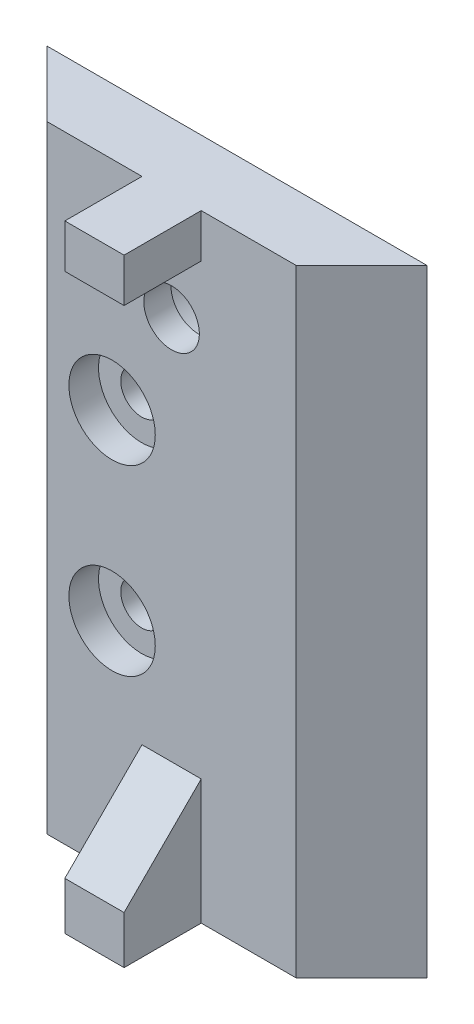
ISO-10303-21;
HEADER;
FILE_DESCRIPTION(('STEP AP214'),'2;1');
FILE_NAME('part.step','',(''),(''),'','','');
FILE_SCHEMA(('AUTOMOTIVE_DESIGN { 1 0 10303 214 1 1 1 1 }'));
ENDSEC;
DATA;
#1=APPLICATION_CONTEXT('core data for automotive mechanical design processes');
#2=APPLICATION_PROTOCOL_DEFINITION('international standard','automotive_design',2000,#1);
#3=PRODUCT_CONTEXT('',#1,'mechanical');
#4=PRODUCT('Part','Part','',(#3));
#5=PRODUCT_RELATED_PRODUCT_CATEGORY('part','',(#4));
#6=PRODUCT_DEFINITION_FORMATION('','',#4);
#7=PRODUCT_DEFINITION_CONTEXT('part definition',#1,'design');
#8=PRODUCT_DEFINITION('design','',#6,#7);
#9=PRODUCT_DEFINITION_SHAPE('','',#8);
#10=(LENGTH_UNIT() NAMED_UNIT(*) SI_UNIT(.MILLI.,.METRE.));
#11=(NAMED_UNIT(*) PLANE_ANGLE_UNIT() SI_UNIT($,.RADIAN.));
#12=(NAMED_UNIT(*) SI_UNIT($,.STERADIAN.) SOLID_ANGLE_UNIT());
#13=UNCERTAINTY_MEASURE_WITH_UNIT(LENGTH_MEASURE(1.E-05),#10,'distance_accuracy_value','');
#14=(GEOMETRIC_REPRESENTATION_CONTEXT(3) GLOBAL_UNCERTAINTY_ASSIGNED_CONTEXT((#13)) GLOBAL_UNIT_ASSIGNED_CONTEXT((#10,
#11,#12)) REPRESENTATION_CONTEXT('',''));
#15=CARTESIAN_POINT('',(0.,0.,0.));
#16=DIRECTION('',(0.,0.,1.));
#17=DIRECTION('',(1.,0.,0.));
#18=AXIS2_PLACEMENT_3D('',#15,#16,#17);
#19=CARTESIAN_POINT('',(10.1,25.,-10.1));
#20=DIRECTION('',(0.,0.,-1.));
#21=DIRECTION('',(-1.,0.,0.));
#22=AXIS2_PLACEMENT_3D('',#19,#20,#21);
#23=PLANE('',#22);
#24=CARTESIAN_POINT('',(0.,16.2790697674419,-10.1));
#25=DIRECTION('',(0.,0.,-1.));
#26=DIRECTION('',(-1.,0.,0.));
#27=AXIS2_PLACEMENT_3D('',#24,#25,#26);
#28=CIRCLE('',#27,2.25);
#29=CARTESIAN_POINT('',(-2.25,16.2790697674419,-10.1));
#30=VERTEX_POINT('',#29);
#31=EDGE_CURVE('E140',#30,#30,#28,.T.);
#32=ORIENTED_EDGE('',*,*,#31,.T.);
#33=EDGE_LOOP('',(#32));
#34=FACE_BOUND('',#33,.T.);
#35=DIRECTION('',(1.,0.,0.));
#36=VECTOR('',#35,1.);
#37=CARTESIAN_POINT('',(-2.6,21.4617325152062,-10.1));
#38=LINE('',#37,#36);
#39=CARTESIAN_POINT('',(-2.4,21.4617325152062,-10.1));
#40=VERTEX_POINT('',#39);
#41=CARTESIAN_POINT('',(2.4,21.4617325152062,-10.1));
#42=VERTEX_POINT('',#41);
#43=EDGE_CURVE('E119',#40,#42,#38,.T.);
#44=ORIENTED_EDGE('',*,*,#43,.F.);
#45=DIRECTION('',(0.,-1.,0.));
#46=VECTOR('',#45,1.);
#47=CARTESIAN_POINT('',(-2.4,25.,-10.1));
#48=LINE('',#47,#46);
#49=CARTESIAN_POINT('',(-2.4,25.,-10.1));
#50=VERTEX_POINT('',#49);
#51=EDGE_CURVE('E158',#50,#40,#48,.T.);
#52=ORIENTED_EDGE('',*,*,#51,.F.);
#53=DIRECTION('',(1.,0.,0.));
#54=VECTOR('',#53,1.);
#55=CARTESIAN_POINT('',(-10.1,25.,-10.1));
#56=LINE('',#55,#54);
#57=CARTESIAN_POINT('',(-10.1,25.,-10.1));
#58=VERTEX_POINT('',#57);
#59=EDGE_CURVE('E231',#58,#50,#56,.T.);
#60=ORIENTED_EDGE('',*,*,#59,.F.);
#61=DIRECTION('',(0.,-1.,0.));
#62=VECTOR('',#61,1.);
#63=CARTESIAN_POINT('',(-10.1,25.,-10.1));
#64=LINE('',#63,#62);
#65=CARTESIAN_POINT('',(-10.1,-25.,-10.1));
#66=VERTEX_POINT('',#65);
#67=EDGE_CURVE('E160',#58,#66,#64,.T.);
#68=ORIENTED_EDGE('',*,*,#67,.T.);
#69=DIRECTION('',(1.,0.,0.));
#70=VECTOR('',#69,1.);
#71=CARTESIAN_POINT('',(-10.1,-25.,-10.1));
#72=LINE('',#71,#70);
#73=CARTESIAN_POINT('',(-2.4,-25.,-10.1));
#74=VERTEX_POINT('',#73);
#75=EDGE_CURVE('E185',#66,#74,#72,.T.);
#76=ORIENTED_EDGE('',*,*,#75,.T.);
#77=CARTESIAN_POINT('',(-2.4,-14.880987875174,-10.1));
#78=VERTEX_POINT('',#77);
#79=EDGE_CURVE('E157',#78,#74,#48,.T.);
#80=ORIENTED_EDGE('',*,*,#79,.F.);
#81=DIRECTION('',(-1.,0.,0.));
#82=VECTOR('',#81,1.);
#83=CARTESIAN_POINT('',(10.1,-14.880987875174,-10.1));
#84=LINE('',#83,#82);
#85=CARTESIAN_POINT('',(2.4,-14.880987875174,-10.1));
#86=VERTEX_POINT('',#85);
#87=EDGE_CURVE('E11',#78,#86,#84,.F.);
#88=ORIENTED_EDGE('',*,*,#87,.T.);
#89=DIRECTION('',(0.,-1.,0.));
#90=VECTOR('',#89,1.);
#91=CARTESIAN_POINT('',(2.4,25.,-10.1));
#92=LINE('',#91,#90);
#93=CARTESIAN_POINT('',(2.4,-25.,-10.1));
#94=VERTEX_POINT('',#93);
#95=EDGE_CURVE('E146',#86,#94,#92,.T.);
#96=ORIENTED_EDGE('',*,*,#95,.T.);
#97=DIRECTION('',(1.,0.,0.));
#98=VECTOR('',#97,1.);
#99=CARTESIAN_POINT('',(10.1,-25.,-10.1));
#100=LINE('',#99,#98);
#101=CARTESIAN_POINT('',(10.1,-25.,-10.1));
#102=VERTEX_POINT('',#101);
#103=EDGE_CURVE('E201',#94,#102,#100,.T.);
#104=ORIENTED_EDGE('',*,*,#103,.T.);
#105=DIRECTION('',(0.,-1.,0.));
#106=VECTOR('',#105,1.);
#107=CARTESIAN_POINT('',(10.1,25.,-10.1));
#108=LINE('',#107,#106);
#109=CARTESIAN_POINT('',(10.1,25.,-10.1));
#110=VERTEX_POINT('',#109);
#111=EDGE_CURVE('E149',#110,#102,#108,.T.);
#112=ORIENTED_EDGE('',*,*,#111,.F.);
#113=DIRECTION('',(1.,0.,0.));
#114=VECTOR('',#113,1.);
#115=CARTESIAN_POINT('',(10.1,25.,-10.1));
#116=LINE('',#115,#114);
#117=CARTESIAN_POINT('',(2.4,25.,-10.1));
#118=VERTEX_POINT('',#117);
#119=EDGE_CURVE('E144',#118,#110,#116,.T.);
#120=ORIENTED_EDGE('',*,*,#119,.F.);
#121=EDGE_CURVE('E136',#118,#42,#92,.T.);
#122=ORIENTED_EDGE('',*,*,#121,.T.);
#123=EDGE_LOOP('',(#44,#52,#60,#68,#76,#80,#88,#96,#104,#112,#120,#122));
#124=FACE_BOUND('',#123,.T.);
#125=CARTESIAN_POINT('',(-4.82176305006965,-7.4,-10.1));
#126=DIRECTION('',(0.,0.,1.));
#127=DIRECTION('',(1.,0.,0.));
#128=AXIS2_PLACEMENT_3D('',#125,#126,#127);
#129=CIRCLE('',#128,3.5);
#130=CARTESIAN_POINT('',(-1.32176305006965,-7.4,-10.1));
#131=VERTEX_POINT('',#130);
#132=EDGE_CURVE('E269',#131,#131,#129,.T.);
#133=ORIENTED_EDGE('',*,*,#132,.F.);
#134=EDGE_LOOP('',(#133));
#135=FACE_BOUND('',#134,.T.);
#136=CARTESIAN_POINT('',(-4.82176305006965,7.4,-10.1));
#137=DIRECTION('',(0.,0.,1.));
#138=DIRECTION('',(1.,0.,0.));
#139=AXIS2_PLACEMENT_3D('',#136,#137,#138);
#140=CIRCLE('',#139,3.5);
#141=CARTESIAN_POINT('',(-1.32176305006965,7.4,-10.1));
#142=VERTEX_POINT('',#141);
#143=EDGE_CURVE('E281',#142,#142,#140,.T.);
#144=ORIENTED_EDGE('',*,*,#143,.F.);
#145=EDGE_LOOP('',(#144));
#146=FACE_BOUND('',#145,.T.);
#147=ADVANCED_FACE('F35',(#34,#124,#135,#146),#23,.F.);
#148=CARTESIAN_POINT('',(-2.4,25.,-10.1));
#149=DIRECTION('',(1.,0.,0.));
#150=DIRECTION('',(0.,0.,-1.));
#151=AXIS2_PLACEMENT_3D('',#148,#149,#150);
#152=PLANE('',#151);
#153=DIRECTION('',(0.,-1.,0.));
#154=VECTOR('',#153,1.);
#155=CARTESIAN_POINT('',(-2.4,25.,-3.85));
#156=LINE('',#155,#154);
#157=CARTESIAN_POINT('',(-2.4,-21.1309878751741,-3.85));
#158=VERTEX_POINT('',#157);
#159=CARTESIAN_POINT('',(-2.4,-25.,-3.85));
#160=VERTEX_POINT('',#159);
#161=EDGE_CURVE('E153',#158,#160,#156,.T.);
#162=ORIENTED_EDGE('',*,*,#161,.F.);
#163=DIRECTION('',(0.,-0.707106781186551,0.707106781186544));
#164=VECTOR('',#163,1.);
#165=CARTESIAN_POINT('',(-2.4,-21.1309878751741,-3.85));
#166=LINE('',#165,#164);
#167=EDGE_CURVE('E166',#158,#78,#166,.F.);
#168=ORIENTED_EDGE('',*,*,#167,.T.);
#169=ORIENTED_EDGE('',*,*,#79,.T.);
#170=DIRECTION('',(0.,0.,1.));
#171=VECTOR('',#170,1.);
#172=CARTESIAN_POINT('',(-2.4,-25.,-10.1));
#173=LINE('',#172,#171);
#174=EDGE_CURVE('E191',#74,#160,#173,.T.);
#175=ORIENTED_EDGE('',*,*,#174,.T.);
#176=EDGE_LOOP('',(#162,#168,#169,#175));
#177=FACE_BOUND('',#176,.T.);
#178=ADVANCED_FACE('F182',(#177),#152,.F.);
#179=CARTESIAN_POINT('',(-2.4,25.,-3.85));
#180=DIRECTION('',(0.,0.,-1.));
#181=DIRECTION('',(-1.,0.,0.));
#182=AXIS2_PLACEMENT_3D('',#179,#180,#181);
#183=PLANE('',#182);
#184=DIRECTION('',(0.,-1.,0.));
#185=VECTOR('',#184,1.);
#186=CARTESIAN_POINT('',(2.4,25.,-3.85));
#187=LINE('',#186,#185);
#188=CARTESIAN_POINT('',(2.4,-21.1309878751741,-3.85));
#189=VERTEX_POINT('',#188);
#190=CARTESIAN_POINT('',(2.4,-25.,-3.85));
#191=VERTEX_POINT('',#190);
#192=EDGE_CURVE('E145',#189,#191,#187,.T.);
#193=ORIENTED_EDGE('',*,*,#192,.F.);
#194=DIRECTION('',(-1.,0.,0.));
#195=VECTOR('',#194,1.);
#196=CARTESIAN_POINT('',(-2.4,-21.1309878751741,-3.85));
#197=LINE('',#196,#195);
#198=EDGE_CURVE('E163',#189,#158,#197,.T.);
#199=ORIENTED_EDGE('',*,*,#198,.T.);
#200=ORIENTED_EDGE('',*,*,#161,.T.);
#201=DIRECTION('',(1.,0.,0.));
#202=VECTOR('',#201,1.);
#203=CARTESIAN_POINT('',(-2.4,-25.,-3.85));
#204=LINE('',#203,#202);
#205=EDGE_CURVE('E179',#160,#191,#204,.T.);
#206=ORIENTED_EDGE('',*,*,#205,.T.);
#207=EDGE_LOOP('',(#193,#199,#200,#206));
#208=FACE_BOUND('',#207,.T.);
#209=ADVANCED_FACE('F176',(#208),#183,.F.);
#210=CARTESIAN_POINT('',(2.4,25.,-10.1));
#211=DIRECTION('',(-1.,0.,0.));
#212=DIRECTION('',(0.,0.,1.));
#213=AXIS2_PLACEMENT_3D('',#210,#211,#212);
#214=PLANE('',#213);
#215=ORIENTED_EDGE('',*,*,#95,.F.);
#216=DIRECTION('',(0.,0.707106781186551,-0.707106781186544));
#217=VECTOR('',#216,1.);
#218=CARTESIAN_POINT('',(2.4,-21.1309878751741,-3.85));
#219=LINE('',#218,#217);
#220=EDGE_CURVE('E45',#86,#189,#219,.F.);
#221=ORIENTED_EDGE('',*,*,#220,.T.);
#222=ORIENTED_EDGE('',*,*,#192,.T.);
#223=DIRECTION('',(0.,0.,-1.));
#224=VECTOR('',#223,1.);
#225=CARTESIAN_POINT('',(2.4,-25.,-10.1));
#226=LINE('',#225,#224);
#227=EDGE_CURVE('E196',#191,#94,#226,.T.);
#228=ORIENTED_EDGE('',*,*,#227,.T.);
#229=EDGE_LOOP('',(#215,#221,#222,#228));
#230=FACE_BOUND('',#229,.T.);
#231=ADVANCED_FACE('F170',(#230),#214,.F.);
#232=CARTESIAN_POINT('',(-15.4,25.,-15.4));
#233=DIRECTION('',(0.707106781186547,0.,-0.707106781186548));
#234=DIRECTION('',(-0.707106781186548,0.,-0.707106781186547));
#235=AXIS2_PLACEMENT_3D('',#232,#233,#234);
#236=PLANE('',#235);
#237=DIRECTION('',(0.707106781186548,0.,0.707106781186547));
#238=VECTOR('',#237,1.);
#239=CARTESIAN_POINT('',(-15.4,-25.,-15.4));
#240=LINE('',#239,#238);
#241=CARTESIAN_POINT('',(-15.4,-25.,-15.4));
#242=VERTEX_POINT('',#241);
#243=EDGE_CURVE('E192',#242,#66,#240,.T.);
#244=ORIENTED_EDGE('',*,*,#243,.T.);
#245=ORIENTED_EDGE('',*,*,#67,.F.);
#246=DIRECTION('',(0.707106781186548,0.,0.707106781186547));
#247=VECTOR('',#246,1.);
#248=CARTESIAN_POINT('',(-15.4,25.,-15.4));
#249=LINE('',#248,#247);
#250=CARTESIAN_POINT('',(-15.4,25.,-15.4));
#251=VERTEX_POINT('',#250);
#252=EDGE_CURVE('E207',#251,#58,#249,.T.);
#253=ORIENTED_EDGE('',*,*,#252,.F.);
#254=DIRECTION('',(0.,-1.,0.));
#255=VECTOR('',#254,1.);
#256=CARTESIAN_POINT('',(-15.4,25.,-15.4));
#257=LINE('',#256,#255);
#258=EDGE_CURVE('E208',#251,#242,#257,.T.);
#259=ORIENTED_EDGE('',*,*,#258,.T.);
#260=EDGE_LOOP('',(#244,#245,#253,#259));
#261=FACE_BOUND('',#260,.T.);
#262=ADVANCED_FACE('F228',(#261),#236,.F.);
#263=ORIENTED_EDGE('',*,*,#51,.T.);
#264=DIRECTION('',(0.,0.,1.));
#265=VECTOR('',#264,1.);
#266=CARTESIAN_POINT('',(-2.4,21.4617325152062,-10.1));
#267=LINE('',#266,#265);
#268=CARTESIAN_POINT('',(-2.4,21.4617325152062,-3.85));
#269=VERTEX_POINT('',#268);
#270=EDGE_CURVE('E125',#40,#269,#267,.T.);
#271=ORIENTED_EDGE('',*,*,#270,.T.);
#272=CARTESIAN_POINT('',(-2.4,25.,-3.85));
#273=VERTEX_POINT('',#272);
#274=EDGE_CURVE('E154',#273,#269,#156,.T.);
#275=ORIENTED_EDGE('',*,*,#274,.F.);
#276=DIRECTION('',(0.,0.,1.));
#277=VECTOR('',#276,1.);
#278=CARTESIAN_POINT('',(-2.4,25.,-10.1));
#279=LINE('',#278,#277);
#280=EDGE_CURVE('E233',#50,#273,#279,.T.);
#281=ORIENTED_EDGE('',*,*,#280,.F.);
#282=EDGE_LOOP('',(#263,#271,#275,#281));
#283=FACE_BOUND('',#282,.T.);
#284=ADVANCED_FACE('F294',(#283),#152,.F.);
#285=ORIENTED_EDGE('',*,*,#274,.T.);
#286=DIRECTION('',(1.,0.,0.));
#287=VECTOR('',#286,1.);
#288=CARTESIAN_POINT('',(-2.4,21.4617325152062,-3.85));
#289=LINE('',#288,#287);
#290=CARTESIAN_POINT('',(2.4,21.4617325152062,-3.85));
#291=VERTEX_POINT('',#290);
#292=EDGE_CURVE('E129',#269,#291,#289,.T.);
#293=ORIENTED_EDGE('',*,*,#292,.T.);
#294=CARTESIAN_POINT('',(2.4,25.,-3.85));
#295=VERTEX_POINT('',#294);
#296=EDGE_CURVE('E139',#295,#291,#187,.T.);
#297=ORIENTED_EDGE('',*,*,#296,.F.);
#298=DIRECTION('',(1.,0.,0.));
#299=VECTOR('',#298,1.);
#300=CARTESIAN_POINT('',(-2.4,25.,-3.85));
#301=LINE('',#300,#299);
#302=EDGE_CURVE('E239',#273,#295,#301,.T.);
#303=ORIENTED_EDGE('',*,*,#302,.F.);
#304=EDGE_LOOP('',(#285,#293,#297,#303));
#305=FACE_BOUND('',#304,.T.);
#306=ADVANCED_FACE('F300',(#305),#183,.F.);
#307=ORIENTED_EDGE('',*,*,#296,.T.);
#308=DIRECTION('',(0.,0.,1.));
#309=VECTOR('',#308,1.);
#310=CARTESIAN_POINT('',(2.4,21.4617325152062,-3.47319618366129));
#311=LINE('',#310,#309);
#312=EDGE_CURVE('E122',#42,#291,#311,.T.);
#313=ORIENTED_EDGE('',*,*,#312,.F.);
#314=ORIENTED_EDGE('',*,*,#121,.F.);
#315=DIRECTION('',(0.,0.,-1.));
#316=VECTOR('',#315,1.);
#317=CARTESIAN_POINT('',(2.4,25.,-10.1));
#318=LINE('',#317,#316);
#319=EDGE_CURVE('E241',#295,#118,#318,.T.);
#320=ORIENTED_EDGE('',*,*,#319,.F.);
#321=EDGE_LOOP('',(#307,#313,#314,#320));
#322=FACE_BOUND('',#321,.T.);
#323=ADVANCED_FACE('F134',(#322),#214,.F.);
#324=CARTESIAN_POINT('',(15.4,25.,-15.4));
#325=DIRECTION('',(-0.707106781186547,0.,-0.707106781186548));
#326=DIRECTION('',(-0.707106781186548,0.,0.707106781186547));
#327=AXIS2_PLACEMENT_3D('',#324,#325,#326);
#328=PLANE('',#327);
#329=DIRECTION('',(0.707106781186548,0.,-0.707106781186547));
#330=VECTOR('',#329,1.);
#331=CARTESIAN_POINT('',(15.4,-25.,-15.4));
#332=LINE('',#331,#330);
#333=CARTESIAN_POINT('',(15.4,-25.,-15.4));
#334=VERTEX_POINT('',#333);
#335=EDGE_CURVE('E203',#102,#334,#332,.T.);
#336=ORIENTED_EDGE('',*,*,#335,.T.);
#337=DIRECTION('',(0.,-1.,0.));
#338=VECTOR('',#337,1.);
#339=CARTESIAN_POINT('',(15.4,25.,-15.4));
#340=LINE('',#339,#338);
#341=CARTESIAN_POINT('',(15.4,25.,-15.4));
#342=VERTEX_POINT('',#341);
#343=EDGE_CURVE('E210',#342,#334,#340,.T.);
#344=ORIENTED_EDGE('',*,*,#343,.F.);
#345=DIRECTION('',(0.707106781186548,0.,-0.707106781186547));
#346=VECTOR('',#345,1.);
#347=CARTESIAN_POINT('',(15.4,25.,-15.4));
#348=LINE('',#347,#346);
#349=EDGE_CURVE('E222',#110,#342,#348,.T.);
#350=ORIENTED_EDGE('',*,*,#349,.F.);
#351=ORIENTED_EDGE('',*,*,#111,.T.);
#352=EDGE_LOOP('',(#336,#344,#350,#351));
#353=FACE_BOUND('',#352,.T.);
#354=ADVANCED_FACE('F221',(#353),#328,.F.);
#355=CARTESIAN_POINT('',(-15.4,25.,-15.4));
#356=DIRECTION('',(0.,0.,1.));
#357=DIRECTION('',(1.,0.,0.));
#358=AXIS2_PLACEMENT_3D('',#355,#356,#357);
#359=PLANE('',#358);
#360=CARTESIAN_POINT('',(-4.82176305006965,7.4,-15.4));
#361=DIRECTION('',(0.,0.,1.));
#362=DIRECTION('',(1.,0.,0.));
#363=AXIS2_PLACEMENT_3D('',#360,#361,#362);
#364=CIRCLE('',#363,1.7);
#365=CARTESIAN_POINT('',(-3.12176305006965,7.4,-15.4));
#366=VERTEX_POINT('',#365);
#367=EDGE_CURVE('E272',#366,#366,#364,.T.);
#368=ORIENTED_EDGE('',*,*,#367,.T.);
#369=EDGE_LOOP('',(#368));
#370=FACE_BOUND('',#369,.T.);
#371=CARTESIAN_POINT('',(-4.82176305006965,-7.4,-15.4));
#372=DIRECTION('',(0.,0.,1.));
#373=DIRECTION('',(1.,0.,0.));
#374=AXIS2_PLACEMENT_3D('',#371,#372,#373);
#375=CIRCLE('',#374,1.7);
#376=CARTESIAN_POINT('',(-3.12176305006965,-7.4,-15.4));
#377=VERTEX_POINT('',#376);
#378=EDGE_CURVE('E260',#377,#377,#375,.T.);
#379=ORIENTED_EDGE('',*,*,#378,.T.);
#380=EDGE_LOOP('',(#379));
#381=FACE_BOUND('',#380,.T.);
#382=CARTESIAN_POINT('',(0.,16.2790697674419,-15.4));
#383=DIRECTION('',(0.,0.,-1.));
#384=DIRECTION('',(-1.,0.,0.));
#385=AXIS2_PLACEMENT_3D('',#382,#383,#384);
#386=CIRCLE('',#385,4.49999999999999);
#387=CARTESIAN_POINT('',(-4.49999999999999,16.2790697674419,-15.4));
#388=VERTEX_POINT('',#387);
#389=EDGE_CURVE('E257',#388,#388,#386,.T.);
#390=ORIENTED_EDGE('',*,*,#389,.F.);
#391=EDGE_LOOP('',(#390));
#392=FACE_BOUND('',#391,.T.);
#393=DIRECTION('',(-1.,0.,0.));
#394=VECTOR('',#393,1.);
#395=CARTESIAN_POINT('',(-15.4,-25.,-15.4));
#396=LINE('',#395,#394);
#397=EDGE_CURVE('E205',#334,#242,#396,.T.);
#398=ORIENTED_EDGE('',*,*,#397,.T.);
#399=ORIENTED_EDGE('',*,*,#258,.F.);
#400=DIRECTION('',(-1.,0.,0.));
#401=VECTOR('',#400,1.);
#402=CARTESIAN_POINT('',(-15.4,25.,-15.4));
#403=LINE('',#402,#401);
#404=EDGE_CURVE('E211',#342,#251,#403,.T.);
#405=ORIENTED_EDGE('',*,*,#404,.F.);
#406=ORIENTED_EDGE('',*,*,#343,.T.);
#407=EDGE_LOOP('',(#398,#399,#405,#406));
#408=FACE_BOUND('',#407,.T.);
#409=ADVANCED_FACE('F225',(#370,#381,#392,#408),#359,.F.);
#410=CARTESIAN_POINT('',(0.,25.,0.));
#411=DIRECTION('',(0.,-1.,0.));
#412=DIRECTION('',(0.,0.,-1.));
#413=AXIS2_PLACEMENT_3D('',#410,#411,#412);
#414=PLANE('',#413);
#415=ORIENTED_EDGE('',*,*,#252,.T.);
#416=ORIENTED_EDGE('',*,*,#59,.T.);
#417=ORIENTED_EDGE('',*,*,#280,.T.);
#418=ORIENTED_EDGE('',*,*,#302,.T.);
#419=ORIENTED_EDGE('',*,*,#319,.T.);
#420=ORIENTED_EDGE('',*,*,#119,.T.);
#421=ORIENTED_EDGE('',*,*,#349,.T.);
#422=ORIENTED_EDGE('',*,*,#404,.T.);
#423=EDGE_LOOP('',(#415,#416,#417,#418,#419,#420,#421,#422));
#424=FACE_BOUND('',#423,.T.);
#425=ADVANCED_FACE('F386',(#424),#414,.F.);
#426=CARTESIAN_POINT('',(0.,-25.,0.));
#427=DIRECTION('',(0.,-1.,0.));
#428=DIRECTION('',(0.,0.,-1.));
#429=AXIS2_PLACEMENT_3D('',#426,#427,#428);
#430=PLANE('',#429);
#431=ORIENTED_EDGE('',*,*,#243,.F.);
#432=ORIENTED_EDGE('',*,*,#397,.F.);
#433=ORIENTED_EDGE('',*,*,#335,.F.);
#434=ORIENTED_EDGE('',*,*,#103,.F.);
#435=ORIENTED_EDGE('',*,*,#227,.F.);
#436=ORIENTED_EDGE('',*,*,#205,.F.);
#437=ORIENTED_EDGE('',*,*,#174,.F.);
#438=ORIENTED_EDGE('',*,*,#75,.F.);
#439=EDGE_LOOP('',(#431,#432,#433,#434,#435,#436,#437,#438));
#440=FACE_BOUND('',#439,.T.);
#441=ADVANCED_FACE('F194',(#440),#430,.T.);
#442=CARTESIAN_POINT('',(-2.6,21.4617325152062,-3.47319618366129));
#443=DIRECTION('',(0.,1.,0.));
#444=DIRECTION('',(0.,0.,1.));
#445=AXIS2_PLACEMENT_3D('',#442,#443,#444);
#446=PLANE('',#445);
#447=ORIENTED_EDGE('',*,*,#43,.T.);
#448=ORIENTED_EDGE('',*,*,#312,.T.);
#449=ORIENTED_EDGE('',*,*,#292,.F.);
#450=ORIENTED_EDGE('',*,*,#270,.F.);
#451=EDGE_LOOP('',(#447,#448,#449,#450));
#452=FACE_BOUND('',#451,.T.);
#453=ADVANCED_FACE('F121',(#452),#446,.F.);
#454=CARTESIAN_POINT('',(0.,16.2790697674419,-15.4));
#455=DIRECTION('',(0.,0.,-1.));
#456=DIRECTION('',(-1.,0.,0.));
#457=AXIS2_PLACEMENT_3D('',#454,#455,#456);
#458=CYLINDRICAL_SURFACE('',#457,2.25);
#459=ORIENTED_EDGE('',*,*,#31,.F.);
#460=EDGE_LOOP('',(#459));
#461=FACE_BOUND('',#460,.T.);
#462=CARTESIAN_POINT('',(0.,16.2790697674419,-12.3));
#463=DIRECTION('',(0.,0.,-1.));
#464=DIRECTION('',(-1.,0.,0.));
#465=AXIS2_PLACEMENT_3D('',#462,#463,#464);
#466=CIRCLE('',#465,2.25);
#467=CARTESIAN_POINT('',(-2.25,16.2790697674419,-12.3));
#468=VERTEX_POINT('',#467);
#469=EDGE_CURVE('E251',#468,#468,#466,.T.);
#470=ORIENTED_EDGE('',*,*,#469,.T.);
#471=EDGE_LOOP('',(#470));
#472=FACE_BOUND('',#471,.T.);
#473=ADVANCED_FACE('F339',(#461,#472),#458,.F.);
#474=CARTESIAN_POINT('',(2.25,16.2790697674419,-12.3));
#475=DIRECTION('',(0.,0.,1.));
#476=DIRECTION('',(1.,0.,0.));
#477=AXIS2_PLACEMENT_3D('',#474,#475,#476);
#478=PLANE('',#477);
#479=ORIENTED_EDGE('',*,*,#469,.F.);
#480=EDGE_LOOP('',(#479));
#481=FACE_BOUND('',#480,.T.);
#482=CARTESIAN_POINT('',(0.,16.2790697674419,-12.3));
#483=DIRECTION('',(0.,0.,-1.));
#484=DIRECTION('',(-1.,0.,0.));
#485=AXIS2_PLACEMENT_3D('',#482,#483,#484);
#486=CIRCLE('',#485,4.5);
#487=CARTESIAN_POINT('',(-4.5,16.2790697674419,-12.3));
#488=VERTEX_POINT('',#487);
#489=EDGE_CURVE('E254',#488,#488,#486,.T.);
#490=ORIENTED_EDGE('',*,*,#489,.T.);
#491=EDGE_LOOP('',(#490));
#492=FACE_BOUND('',#491,.T.);
#493=ADVANCED_FACE('F327',(#481,#492),#478,.F.);
#494=CARTESIAN_POINT('',(0.,16.2790697674419,-15.4));
#495=DIRECTION('',(0.,0.,-1.));
#496=DIRECTION('',(-1.,0.,0.));
#497=AXIS2_PLACEMENT_3D('',#494,#495,#496);
#498=CYLINDRICAL_SURFACE('',#497,4.5);
#499=ORIENTED_EDGE('',*,*,#489,.F.);
#500=EDGE_LOOP('',(#499));
#501=FACE_BOUND('',#500,.T.);
#502=ORIENTED_EDGE('',*,*,#389,.T.);
#503=EDGE_LOOP('',(#502));
#504=FACE_BOUND('',#503,.T.);
#505=ADVANCED_FACE('F322',(#501,#504),#498,.F.);
#506=CARTESIAN_POINT('',(-2.4,-21.1309878751741,-3.85));
#507=DIRECTION('',(0.,-0.707106781186544,-0.707106781186551));
#508=DIRECTION('',(-1.,0.,0.));
#509=AXIS2_PLACEMENT_3D('',#506,#507,#508);
#510=PLANE('',#509);
#511=ORIENTED_EDGE('',*,*,#220,.F.);
#512=ORIENTED_EDGE('',*,*,#87,.F.);
#513=ORIENTED_EDGE('',*,*,#167,.F.);
#514=ORIENTED_EDGE('',*,*,#198,.F.);
#515=EDGE_LOOP('',(#511,#512,#513,#514));
#516=FACE_BOUND('',#515,.T.);
#517=ADVANCED_FACE('F38',(#516),#510,.F.);
#518=CARTESIAN_POINT('',(-4.82176305006965,-7.4,-10.1));
#519=DIRECTION('',(0.,0.,1.));
#520=DIRECTION('',(1.,0.,0.));
#521=AXIS2_PLACEMENT_3D('',#518,#519,#520);
#522=CYLINDRICAL_SURFACE('',#521,1.7);
#523=ORIENTED_EDGE('',*,*,#378,.F.);
#524=EDGE_LOOP('',(#523));
#525=FACE_BOUND('',#524,.T.);
#526=CARTESIAN_POINT('',(-4.82176305006965,-7.4,-12.5));
#527=DIRECTION('',(0.,0.,1.));
#528=DIRECTION('',(1.,0.,0.));
#529=AXIS2_PLACEMENT_3D('',#526,#527,#528);
#530=CIRCLE('',#529,1.7);
#531=CARTESIAN_POINT('',(-3.12176305006965,-7.4,-12.5));
#532=VERTEX_POINT('',#531);
#533=EDGE_CURVE('E263',#532,#532,#530,.T.);
#534=ORIENTED_EDGE('',*,*,#533,.T.);
#535=EDGE_LOOP('',(#534));
#536=FACE_BOUND('',#535,.T.);
#537=ADVANCED_FACE('F421',(#525,#536),#522,.F.);
#538=CARTESIAN_POINT('',(-3.12176305006965,-7.4,-12.5));
#539=DIRECTION('',(0.,0.,-1.));
#540=DIRECTION('',(-1.,0.,0.));
#541=AXIS2_PLACEMENT_3D('',#538,#539,#540);
#542=PLANE('',#541);
#543=ORIENTED_EDGE('',*,*,#533,.F.);
#544=EDGE_LOOP('',(#543));
#545=FACE_BOUND('',#544,.T.);
#546=CARTESIAN_POINT('',(-4.82176305006965,-7.4,-12.5));
#547=DIRECTION('',(0.,0.,1.));
#548=DIRECTION('',(1.,0.,0.));
#549=AXIS2_PLACEMENT_3D('',#546,#547,#548);
#550=CIRCLE('',#549,3.5);
#551=CARTESIAN_POINT('',(-1.32176305006965,-7.4,-12.5));
#552=VERTEX_POINT('',#551);
#553=EDGE_CURVE('E266',#552,#552,#550,.T.);
#554=ORIENTED_EDGE('',*,*,#553,.T.);
#555=EDGE_LOOP('',(#554));
#556=FACE_BOUND('',#555,.T.);
#557=ADVANCED_FACE('F426',(#545,#556),#542,.F.);
#558=CARTESIAN_POINT('',(-4.82176305006965,-7.4,-10.1));
#559=DIRECTION('',(0.,0.,1.));
#560=DIRECTION('',(1.,0.,0.));
#561=AXIS2_PLACEMENT_3D('',#558,#559,#560);
#562=CYLINDRICAL_SURFACE('',#561,3.5);
#563=ORIENTED_EDGE('',*,*,#553,.F.);
#564=EDGE_LOOP('',(#563));
#565=FACE_BOUND('',#564,.T.);
#566=ORIENTED_EDGE('',*,*,#132,.T.);
#567=EDGE_LOOP('',(#566));
#568=FACE_BOUND('',#567,.T.);
#569=ADVANCED_FACE('F436',(#565,#568),#562,.F.);
#570=CARTESIAN_POINT('',(-4.82176305006965,7.4,-10.1));
#571=DIRECTION('',(0.,0.,1.));
#572=DIRECTION('',(1.,0.,0.));
#573=AXIS2_PLACEMENT_3D('',#570,#571,#572);
#574=CYLINDRICAL_SURFACE('',#573,1.7);
#575=ORIENTED_EDGE('',*,*,#367,.F.);
#576=EDGE_LOOP('',(#575));
#577=FACE_BOUND('',#576,.T.);
#578=CARTESIAN_POINT('',(-4.82176305006965,7.4,-12.5));
#579=DIRECTION('',(0.,0.,1.));
#580=DIRECTION('',(1.,0.,0.));
#581=AXIS2_PLACEMENT_3D('',#578,#579,#580);
#582=CIRCLE('',#581,1.7);
#583=CARTESIAN_POINT('',(-3.12176305006965,7.4,-12.5));
#584=VERTEX_POINT('',#583);
#585=EDGE_CURVE('E275',#584,#584,#582,.T.);
#586=ORIENTED_EDGE('',*,*,#585,.T.);
#587=EDGE_LOOP('',(#586));
#588=FACE_BOUND('',#587,.T.);
#589=ADVANCED_FACE('F446',(#577,#588),#574,.F.);
#590=CARTESIAN_POINT('',(-3.12176305006965,7.4,-12.5));
#591=DIRECTION('',(0.,0.,-1.));
#592=DIRECTION('',(-1.,0.,0.));
#593=AXIS2_PLACEMENT_3D('',#590,#591,#592);
#594=PLANE('',#593);
#595=ORIENTED_EDGE('',*,*,#585,.F.);
#596=EDGE_LOOP('',(#595));
#597=FACE_BOUND('',#596,.T.);
#598=CARTESIAN_POINT('',(-4.82176305006965,7.4,-12.5));
#599=DIRECTION('',(0.,0.,1.));
#600=DIRECTION('',(1.,0.,0.));
#601=AXIS2_PLACEMENT_3D('',#598,#599,#600);
#602=CIRCLE('',#601,3.5);
#603=CARTESIAN_POINT('',(-1.32176305006965,7.4,-12.5));
#604=VERTEX_POINT('',#603);
#605=EDGE_CURVE('E278',#604,#604,#602,.T.);
#606=ORIENTED_EDGE('',*,*,#605,.T.);
#607=EDGE_LOOP('',(#606));
#608=FACE_BOUND('',#607,.T.);
#609=ADVANCED_FACE('F456',(#597,#608),#594,.F.);
#610=CARTESIAN_POINT('',(-4.82176305006965,7.4,-10.1));
#611=DIRECTION('',(0.,0.,1.));
#612=DIRECTION('',(1.,0.,0.));
#613=AXIS2_PLACEMENT_3D('',#610,#611,#612);
#614=CYLINDRICAL_SURFACE('',#613,3.5);
#615=ORIENTED_EDGE('',*,*,#605,.F.);
#616=EDGE_LOOP('',(#615));
#617=FACE_BOUND('',#616,.T.);
#618=ORIENTED_EDGE('',*,*,#143,.T.);
#619=EDGE_LOOP('',(#618));
#620=FACE_BOUND('',#619,.T.);
#621=ADVANCED_FACE('F285',(#617,#620),#614,.F.);
#622=CLOSED_SHELL('',(#147,#178,#209,#231,#262,#284,#306,#323,#354,#409,#425,#441,#453,#473,
#493,#505,#517,#537,#557,#569,#589,#609,#621));
#623=MANIFOLD_SOLID_BREP('B2',#622);
#624=ADVANCED_BREP_SHAPE_REPRESENTATION('',(#18,#623),#14);
#625=SHAPE_DEFINITION_REPRESENTATION(#9,#624);
ENDSEC;
END-ISO-10303-21;
